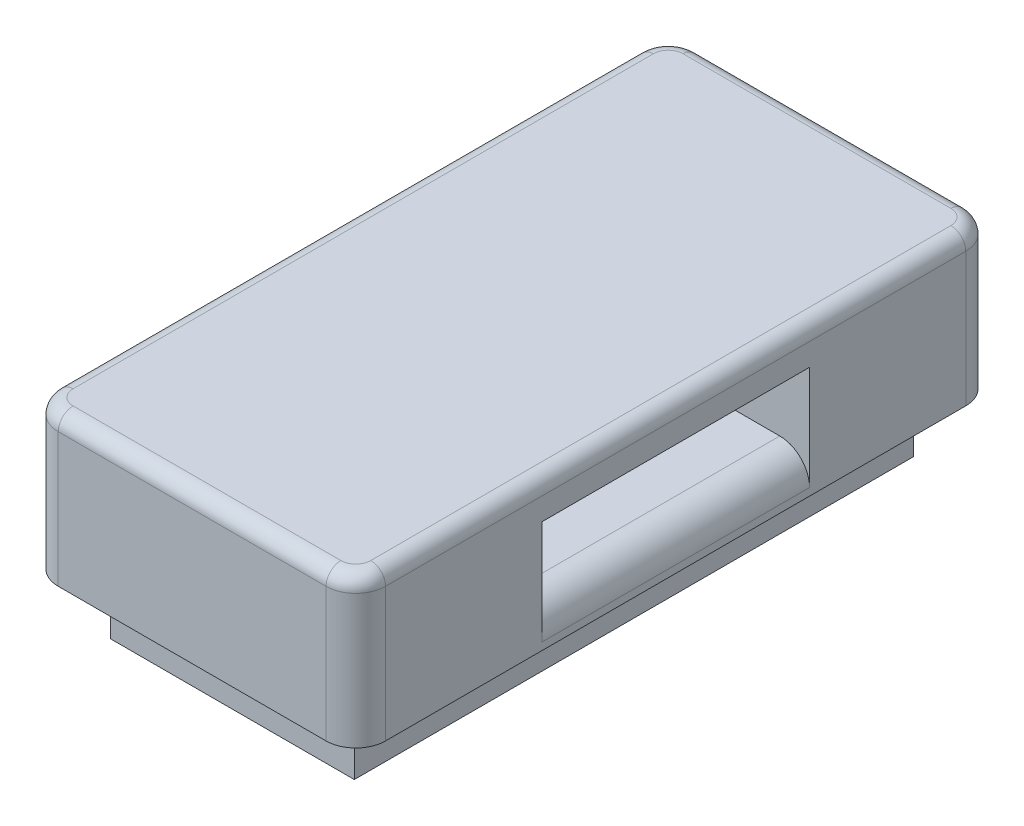
ISO-10303-21;
HEADER;
FILE_DESCRIPTION(('STEP AP214'),'2;1');
FILE_NAME('part.step','',(''),(''),'','','');
FILE_SCHEMA(('AUTOMOTIVE_DESIGN { 1 0 10303 214 1 1 1 1 }'));
ENDSEC;
DATA;
#1=APPLICATION_CONTEXT('core data for automotive mechanical design processes');
#2=APPLICATION_PROTOCOL_DEFINITION('international standard','automotive_design',2000,#1);
#3=PRODUCT_CONTEXT('',#1,'mechanical');
#4=PRODUCT('Part','Part','',(#3));
#5=PRODUCT_RELATED_PRODUCT_CATEGORY('part','',(#4));
#6=PRODUCT_DEFINITION_FORMATION('','',#4);
#7=PRODUCT_DEFINITION_CONTEXT('part definition',#1,'design');
#8=PRODUCT_DEFINITION('design','',#6,#7);
#9=PRODUCT_DEFINITION_SHAPE('','',#8);
#10=(LENGTH_UNIT() NAMED_UNIT(*) SI_UNIT(.MILLI.,.METRE.));
#11=(NAMED_UNIT(*) PLANE_ANGLE_UNIT() SI_UNIT($,.RADIAN.));
#12=(NAMED_UNIT(*) SI_UNIT($,.STERADIAN.) SOLID_ANGLE_UNIT());
#13=UNCERTAINTY_MEASURE_WITH_UNIT(LENGTH_MEASURE(1.E-05),#10,'distance_accuracy_value','');
#14=(GEOMETRIC_REPRESENTATION_CONTEXT(3) GLOBAL_UNCERTAINTY_ASSIGNED_CONTEXT((#13)) GLOBAL_UNIT_ASSIGNED_CONTEXT((#10,
#11,#12)) REPRESENTATION_CONTEXT('',''));
#15=CARTESIAN_POINT('',(0.,0.,0.));
#16=DIRECTION('',(0.,0.,1.));
#17=DIRECTION('',(1.,0.,0.));
#18=AXIS2_PLACEMENT_3D('',#15,#16,#17);
#19=CARTESIAN_POINT('',(-9.,10.,-19.5));
#20=DIRECTION('',(0.,-1.,0.));
#21=DIRECTION('',(0.,0.,-1.));
#22=AXIS2_PLACEMENT_3D('',#19,#20,#21);
#23=CYLINDRICAL_SURFACE('',#22,2.);
#24=DIRECTION('',(0.,-1.,0.));
#25=VECTOR('',#24,1.);
#26=CARTESIAN_POINT('',(-11.,10.,-19.5));
#27=LINE('',#26,#25);
#28=CARTESIAN_POINT('',(-11.,9.,-19.5));
#29=VERTEX_POINT('',#28);
#30=CARTESIAN_POINT('',(-11.,0.,-19.5));
#31=VERTEX_POINT('',#30);
#32=EDGE_CURVE('E320',#29,#31,#27,.T.);
#33=ORIENTED_EDGE('',*,*,#32,.F.);
#34=CARTESIAN_POINT('',(-9.,9.,-19.5));
#35=DIRECTION('',(0.,-1.,0.));
#36=DIRECTION('',(0.,0.,-1.));
#37=AXIS2_PLACEMENT_3D('',#34,#35,#36);
#38=CIRCLE('',#37,2.);
#39=CARTESIAN_POINT('',(-8.99999999999998,9.,-21.5));
#40=VERTEX_POINT('',#39);
#41=EDGE_CURVE('E401',#29,#40,#38,.T.);
#42=ORIENTED_EDGE('',*,*,#41,.T.);
#43=DIRECTION('',(0.,-1.,0.));
#44=VECTOR('',#43,1.);
#45=CARTESIAN_POINT('',(-8.99999999999998,10.,-21.5));
#46=LINE('',#45,#44);
#47=CARTESIAN_POINT('',(-8.99999999999998,0.,-21.5));
#48=VERTEX_POINT('',#47);
#49=EDGE_CURVE('E319',#40,#48,#46,.T.);
#50=ORIENTED_EDGE('',*,*,#49,.T.);
#51=CARTESIAN_POINT('',(-9.,0.,-19.5));
#52=DIRECTION('',(0.,-1.,0.));
#53=DIRECTION('',(0.,0.,-1.));
#54=AXIS2_PLACEMENT_3D('',#51,#52,#53);
#55=CIRCLE('',#54,2.);
#56=EDGE_CURVE('E278',#31,#48,#55,.T.);
#57=ORIENTED_EDGE('',*,*,#56,.F.);
#58=EDGE_LOOP('',(#33,#42,#50,#57));
#59=FACE_BOUND('',#58,.T.);
#60=ADVANCED_FACE('F46',(#59),#23,.T.);
#61=CARTESIAN_POINT('',(-11.,10.,19.5));
#62=DIRECTION('',(-1.,0.,0.));
#63=DIRECTION('',(0.,0.,1.));
#64=AXIS2_PLACEMENT_3D('',#61,#62,#63);
#65=PLANE('',#64);
#66=DIRECTION('',(0.,0.,-1.));
#67=VECTOR('',#66,1.);
#68=CARTESIAN_POINT('',(-11.,0.499999999999999,19.5));
#69=LINE('',#68,#67);
#70=CARTESIAN_POINT('',(-11.,0.499999999999999,9.));
#71=VERTEX_POINT('',#70);
#72=CARTESIAN_POINT('',(-11.,0.499999999999999,-9.));
#73=VERTEX_POINT('',#72);
#74=EDGE_CURVE('E353',#71,#73,#69,.T.);
#75=ORIENTED_EDGE('',*,*,#74,.T.);
#76=DIRECTION('',(0.,-1.,0.));
#77=VECTOR('',#76,1.);
#78=CARTESIAN_POINT('',(-11.,7.5,-9.));
#79=LINE('',#78,#77);
#80=CARTESIAN_POINT('',(-11.,7.5,-9.));
#81=VERTEX_POINT('',#80);
#82=EDGE_CURVE('E226',#81,#73,#79,.T.);
#83=ORIENTED_EDGE('',*,*,#82,.F.);
#84=DIRECTION('',(0.,0.,-1.));
#85=VECTOR('',#84,1.);
#86=CARTESIAN_POINT('',(-11.,7.5,9.));
#87=LINE('',#86,#85);
#88=CARTESIAN_POINT('',(-11.,7.5,9.));
#89=VERTEX_POINT('',#88);
#90=EDGE_CURVE('E204',#89,#81,#87,.T.);
#91=ORIENTED_EDGE('',*,*,#90,.F.);
#92=DIRECTION('',(0.,-1.,0.));
#93=VECTOR('',#92,1.);
#94=CARTESIAN_POINT('',(-11.,7.5,9.));
#95=LINE('',#94,#93);
#96=EDGE_CURVE('E223',#89,#71,#95,.T.);
#97=ORIENTED_EDGE('',*,*,#96,.T.);
#98=EDGE_LOOP('',(#75,#83,#91,#97));
#99=FACE_BOUND('',#98,.T.);
#100=DIRECTION('',(0.,-1.,0.));
#101=VECTOR('',#100,1.);
#102=CARTESIAN_POINT('',(-11.,10.,19.5));
#103=LINE('',#102,#101);
#104=CARTESIAN_POINT('',(-11.,9.,19.5));
#105=VERTEX_POINT('',#104);
#106=CARTESIAN_POINT('',(-11.,0.,19.5));
#107=VERTEX_POINT('',#106);
#108=EDGE_CURVE('E324',#105,#107,#103,.T.);
#109=ORIENTED_EDGE('',*,*,#108,.F.);
#110=DIRECTION('',(0.,0.,-1.));
#111=VECTOR('',#110,1.);
#112=CARTESIAN_POINT('',(-11.,9.,-19.5));
#113=LINE('',#112,#111);
#114=EDGE_CURVE('E398',#105,#29,#113,.T.);
#115=ORIENTED_EDGE('',*,*,#114,.T.);
#116=ORIENTED_EDGE('',*,*,#32,.T.);
#117=DIRECTION('',(0.,0.,-1.));
#118=VECTOR('',#117,1.);
#119=CARTESIAN_POINT('',(-11.,0.,19.5));
#120=LINE('',#119,#118);
#121=EDGE_CURVE('E315',#107,#31,#120,.T.);
#122=ORIENTED_EDGE('',*,*,#121,.F.);
#123=EDGE_LOOP('',(#109,#115,#116,#122));
#124=FACE_BOUND('',#123,.T.);
#125=ADVANCED_FACE('F478',(#99,#124),#65,.T.);
#126=CARTESIAN_POINT('',(-9.,10.,19.5));
#127=DIRECTION('',(0.,-1.,0.));
#128=DIRECTION('',(0.,0.,-1.));
#129=AXIS2_PLACEMENT_3D('',#126,#127,#128);
#130=CYLINDRICAL_SURFACE('',#129,2.);
#131=DIRECTION('',(0.,-1.,0.));
#132=VECTOR('',#131,1.);
#133=CARTESIAN_POINT('',(-8.99999999999998,10.,21.5));
#134=LINE('',#133,#132);
#135=CARTESIAN_POINT('',(-8.99999999999998,9.,21.5));
#136=VERTEX_POINT('',#135);
#137=CARTESIAN_POINT('',(-8.99999999999998,0.,21.5));
#138=VERTEX_POINT('',#137);
#139=EDGE_CURVE('E327',#136,#138,#134,.T.);
#140=ORIENTED_EDGE('',*,*,#139,.F.);
#141=CARTESIAN_POINT('',(-9.,9.,19.5));
#142=DIRECTION('',(0.,-1.,0.));
#143=DIRECTION('',(0.,0.,-1.));
#144=AXIS2_PLACEMENT_3D('',#141,#142,#143);
#145=CIRCLE('',#144,2.);
#146=EDGE_CURVE('E369',#136,#105,#145,.T.);
#147=ORIENTED_EDGE('',*,*,#146,.T.);
#148=ORIENTED_EDGE('',*,*,#108,.T.);
#149=CARTESIAN_POINT('',(-9.,0.,19.5));
#150=DIRECTION('',(0.,-1.,0.));
#151=DIRECTION('',(0.,0.,-1.));
#152=AXIS2_PLACEMENT_3D('',#149,#150,#151);
#153=CIRCLE('',#152,2.);
#154=EDGE_CURVE('E311',#138,#107,#153,.T.);
#155=ORIENTED_EDGE('',*,*,#154,.F.);
#156=EDGE_LOOP('',(#140,#147,#148,#155));
#157=FACE_BOUND('',#156,.T.);
#158=ADVANCED_FACE('F471',(#157),#130,.T.);
#159=CARTESIAN_POINT('',(-8.99999999999998,10.,21.5));
#160=DIRECTION('',(0.,0.,-1.));
#161=DIRECTION('',(-1.,0.,0.));
#162=AXIS2_PLACEMENT_3D('',#159,#160,#161);
#163=PLANE('',#162);
#164=DIRECTION('',(0.,-1.,0.));
#165=VECTOR('',#164,1.);
#166=CARTESIAN_POINT('',(8.99999999999999,10.,21.5));
#167=LINE('',#166,#165);
#168=CARTESIAN_POINT('',(8.99999999999999,9.,21.5));
#169=VERTEX_POINT('',#168);
#170=CARTESIAN_POINT('',(8.99999999999999,0.,21.5));
#171=VERTEX_POINT('',#170);
#172=EDGE_CURVE('E330',#169,#171,#167,.T.);
#173=ORIENTED_EDGE('',*,*,#172,.F.);
#174=DIRECTION('',(1.,0.,0.));
#175=VECTOR('',#174,1.);
#176=CARTESIAN_POINT('',(-8.99999999999998,9.,21.5));
#177=LINE('',#176,#175);
#178=EDGE_CURVE('E11',#169,#136,#177,.F.);
#179=ORIENTED_EDGE('',*,*,#178,.T.);
#180=ORIENTED_EDGE('',*,*,#139,.T.);
#181=DIRECTION('',(1.,0.,0.));
#182=VECTOR('',#181,1.);
#183=CARTESIAN_POINT('',(-8.99999999999998,0.,21.5));
#184=LINE('',#183,#182);
#185=EDGE_CURVE('E307',#138,#171,#184,.T.);
#186=ORIENTED_EDGE('',*,*,#185,.T.);
#187=EDGE_LOOP('',(#173,#179,#180,#186));
#188=FACE_BOUND('',#187,.T.);
#189=ADVANCED_FACE('F467',(#188),#163,.F.);
#190=CARTESIAN_POINT('',(9.,10.,19.5));
#191=DIRECTION('',(0.,-1.,0.));
#192=DIRECTION('',(0.,0.,-1.));
#193=AXIS2_PLACEMENT_3D('',#190,#191,#192);
#194=CYLINDRICAL_SURFACE('',#193,2.);
#195=DIRECTION('',(0.,-1.,0.));
#196=VECTOR('',#195,1.);
#197=CARTESIAN_POINT('',(11.,10.,19.5));
#198=LINE('',#197,#196);
#199=CARTESIAN_POINT('',(11.,9.,19.5));
#200=VERTEX_POINT('',#199);
#201=CARTESIAN_POINT('',(11.,0.,19.5));
#202=VERTEX_POINT('',#201);
#203=EDGE_CURVE('E333',#200,#202,#198,.T.);
#204=ORIENTED_EDGE('',*,*,#203,.F.);
#205=CARTESIAN_POINT('',(9.,9.,19.5));
#206=DIRECTION('',(0.,-1.,0.));
#207=DIRECTION('',(0.,0.,-1.));
#208=AXIS2_PLACEMENT_3D('',#205,#206,#207);
#209=CIRCLE('',#208,2.);
#210=EDGE_CURVE('E56',#200,#169,#209,.T.);
#211=ORIENTED_EDGE('',*,*,#210,.T.);
#212=ORIENTED_EDGE('',*,*,#172,.T.);
#213=CARTESIAN_POINT('',(9.,0.,19.5));
#214=DIRECTION('',(0.,1.,0.));
#215=DIRECTION('',(0.,0.,1.));
#216=AXIS2_PLACEMENT_3D('',#213,#214,#215);
#217=CIRCLE('',#216,2.);
#218=EDGE_CURVE('E303',#171,#202,#217,.T.);
#219=ORIENTED_EDGE('',*,*,#218,.T.);
#220=EDGE_LOOP('',(#204,#211,#212,#219));
#221=FACE_BOUND('',#220,.T.);
#222=ADVANCED_FACE('F493',(#221),#194,.T.);
#223=CARTESIAN_POINT('',(11.,10.,19.5));
#224=DIRECTION('',(-1.,0.,0.));
#225=DIRECTION('',(0.,0.,1.));
#226=AXIS2_PLACEMENT_3D('',#223,#224,#225);
#227=PLANE('',#226);
#228=DIRECTION('',(0.,-1.,0.));
#229=VECTOR('',#228,1.);
#230=CARTESIAN_POINT('',(11.,7.5,-9.));
#231=LINE('',#230,#229);
#232=CARTESIAN_POINT('',(11.,7.5,-9.));
#233=VERTEX_POINT('',#232);
#234=CARTESIAN_POINT('',(11.,0.5,-9.));
#235=VERTEX_POINT('',#234);
#236=EDGE_CURVE('E212',#233,#235,#231,.T.);
#237=ORIENTED_EDGE('',*,*,#236,.T.);
#238=DIRECTION('',(0.,0.,-1.));
#239=VECTOR('',#238,1.);
#240=CARTESIAN_POINT('',(11.,0.5,9.));
#241=LINE('',#240,#239);
#242=CARTESIAN_POINT('',(11.,0.5,9.));
#243=VERTEX_POINT('',#242);
#244=EDGE_CURVE('E350',#235,#243,#241,.F.);
#245=ORIENTED_EDGE('',*,*,#244,.T.);
#246=DIRECTION('',(0.,-1.,0.));
#247=VECTOR('',#246,1.);
#248=CARTESIAN_POINT('',(11.,7.5,9.));
#249=LINE('',#248,#247);
#250=CARTESIAN_POINT('',(11.,7.5,9.));
#251=VERTEX_POINT('',#250);
#252=EDGE_CURVE('E209',#251,#243,#249,.T.);
#253=ORIENTED_EDGE('',*,*,#252,.F.);
#254=DIRECTION('',(0.,0.,-1.));
#255=VECTOR('',#254,1.);
#256=CARTESIAN_POINT('',(11.,7.5,9.));
#257=LINE('',#256,#255);
#258=EDGE_CURVE('E201',#251,#233,#257,.T.);
#259=ORIENTED_EDGE('',*,*,#258,.T.);
#260=EDGE_LOOP('',(#237,#245,#253,#259));
#261=FACE_BOUND('',#260,.T.);
#262=DIRECTION('',(0.,-1.,0.));
#263=VECTOR('',#262,1.);
#264=CARTESIAN_POINT('',(11.,10.,-19.5));
#265=LINE('',#264,#263);
#266=CARTESIAN_POINT('',(11.,9.,-19.5));
#267=VERTEX_POINT('',#266);
#268=CARTESIAN_POINT('',(11.,0.,-19.5));
#269=VERTEX_POINT('',#268);
#270=EDGE_CURVE('E336',#267,#269,#265,.T.);
#271=ORIENTED_EDGE('',*,*,#270,.F.);
#272=DIRECTION('',(0.,0.,-1.));
#273=VECTOR('',#272,1.);
#274=CARTESIAN_POINT('',(11.,9.,19.5));
#275=LINE('',#274,#273);
#276=EDGE_CURVE('E71',#267,#200,#275,.F.);
#277=ORIENTED_EDGE('',*,*,#276,.T.);
#278=ORIENTED_EDGE('',*,*,#203,.T.);
#279=DIRECTION('',(0.,0.,-1.));
#280=VECTOR('',#279,1.);
#281=CARTESIAN_POINT('',(11.,0.,19.5));
#282=LINE('',#281,#280);
#283=EDGE_CURVE('E299',#202,#269,#282,.T.);
#284=ORIENTED_EDGE('',*,*,#283,.T.);
#285=EDGE_LOOP('',(#271,#277,#278,#284));
#286=FACE_BOUND('',#285,.T.);
#287=ADVANCED_FACE('F221',(#261,#286),#227,.F.);
#288=CARTESIAN_POINT('',(9.,10.,-19.5));
#289=DIRECTION('',(0.,-1.,0.));
#290=DIRECTION('',(0.,0.,-1.));
#291=AXIS2_PLACEMENT_3D('',#288,#289,#290);
#292=CYLINDRICAL_SURFACE('',#291,2.);
#293=DIRECTION('',(0.,-1.,0.));
#294=VECTOR('',#293,1.);
#295=CARTESIAN_POINT('',(8.99999999999999,10.,-21.5));
#296=LINE('',#295,#294);
#297=CARTESIAN_POINT('',(8.99999999999999,9.,-21.5));
#298=VERTEX_POINT('',#297);
#299=CARTESIAN_POINT('',(8.99999999999999,0.,-21.5));
#300=VERTEX_POINT('',#299);
#301=EDGE_CURVE('E339',#298,#300,#296,.T.);
#302=ORIENTED_EDGE('',*,*,#301,.F.);
#303=CARTESIAN_POINT('',(9.,9.,-19.5));
#304=DIRECTION('',(0.,-1.,0.));
#305=DIRECTION('',(0.,0.,-1.));
#306=AXIS2_PLACEMENT_3D('',#303,#304,#305);
#307=CIRCLE('',#306,2.);
#308=EDGE_CURVE('E407',#298,#267,#307,.T.);
#309=ORIENTED_EDGE('',*,*,#308,.T.);
#310=ORIENTED_EDGE('',*,*,#270,.T.);
#311=CARTESIAN_POINT('',(9.,0.,-19.5));
#312=DIRECTION('',(0.,-1.,0.));
#313=DIRECTION('',(0.,0.,-1.));
#314=AXIS2_PLACEMENT_3D('',#311,#312,#313);
#315=CIRCLE('',#314,2.);
#316=EDGE_CURVE('E295',#300,#269,#315,.T.);
#317=ORIENTED_EDGE('',*,*,#316,.F.);
#318=EDGE_LOOP('',(#302,#309,#310,#317));
#319=FACE_BOUND('',#318,.T.);
#320=ADVANCED_FACE('F492',(#319),#292,.T.);
#321=CARTESIAN_POINT('',(-8.99999999999998,10.,-21.5));
#322=DIRECTION('',(0.,0.,-1.));
#323=DIRECTION('',(-1.,0.,0.));
#324=AXIS2_PLACEMENT_3D('',#321,#322,#323);
#325=PLANE('',#324);
#326=ORIENTED_EDGE('',*,*,#49,.F.);
#327=DIRECTION('',(1.,0.,0.));
#328=VECTOR('',#327,1.);
#329=CARTESIAN_POINT('',(8.99999999999999,9.,-21.5));
#330=LINE('',#329,#328);
#331=EDGE_CURVE('E404',#40,#298,#330,.T.);
#332=ORIENTED_EDGE('',*,*,#331,.T.);
#333=ORIENTED_EDGE('',*,*,#301,.T.);
#334=DIRECTION('',(1.,0.,0.));
#335=VECTOR('',#334,1.);
#336=CARTESIAN_POINT('',(-8.99999999999998,0.,-21.5));
#337=LINE('',#336,#335);
#338=EDGE_CURVE('E291',#48,#300,#337,.T.);
#339=ORIENTED_EDGE('',*,*,#338,.F.);
#340=EDGE_LOOP('',(#326,#332,#333,#339));
#341=FACE_BOUND('',#340,.T.);
#342=ADVANCED_FACE('F489',(#341),#325,.T.);
#343=CARTESIAN_POINT('',(-9.,10.,-19.5));
#344=DIRECTION('',(0.,-1.,0.));
#345=DIRECTION('',(0.,0.,-1.));
#346=AXIS2_PLACEMENT_3D('',#343,#344,#345);
#347=PLANE('',#346);
#348=DIRECTION('',(0.,0.,-1.));
#349=VECTOR('',#348,1.);
#350=CARTESIAN_POINT('',(-10.,10.,19.5));
#351=LINE('',#350,#349);
#352=CARTESIAN_POINT('',(-10.,10.,-19.5));
#353=VERTEX_POINT('',#352);
#354=CARTESIAN_POINT('',(-10.,10.,19.5));
#355=VERTEX_POINT('',#354);
#356=EDGE_CURVE('E391',#353,#355,#351,.F.);
#357=ORIENTED_EDGE('',*,*,#356,.T.);
#358=CARTESIAN_POINT('',(-9.,10.,19.5));
#359=DIRECTION('',(0.,-1.,0.));
#360=DIRECTION('',(0.,0.,-1.));
#361=AXIS2_PLACEMENT_3D('',#358,#359,#360);
#362=CIRCLE('',#361,0.999999999999999);
#363=CARTESIAN_POINT('',(-8.99999999999999,10.,20.5));
#364=VERTEX_POINT('',#363);
#365=EDGE_CURVE('E394',#355,#364,#362,.F.);
#366=ORIENTED_EDGE('',*,*,#365,.T.);
#367=DIRECTION('',(1.,0.,0.));
#368=VECTOR('',#367,1.);
#369=CARTESIAN_POINT('',(-9.,10.,20.5));
#370=LINE('',#369,#368);
#371=CARTESIAN_POINT('',(8.99999999999999,10.,20.5));
#372=VERTEX_POINT('',#371);
#373=EDGE_CURVE('E373',#364,#372,#370,.T.);
#374=ORIENTED_EDGE('',*,*,#373,.T.);
#375=CARTESIAN_POINT('',(9.,10.,19.5));
#376=DIRECTION('',(0.,-1.,0.));
#377=DIRECTION('',(0.,0.,-1.));
#378=AXIS2_PLACEMENT_3D('',#375,#376,#377);
#379=CIRCLE('',#378,0.999999999999999);
#380=CARTESIAN_POINT('',(10.,10.,19.5));
#381=VERTEX_POINT('',#380);
#382=EDGE_CURVE('E376',#372,#381,#379,.F.);
#383=ORIENTED_EDGE('',*,*,#382,.T.);
#384=DIRECTION('',(0.,0.,-1.));
#385=VECTOR('',#384,1.);
#386=CARTESIAN_POINT('',(10.,10.,-19.5));
#387=LINE('',#386,#385);
#388=CARTESIAN_POINT('',(10.,10.,-19.5));
#389=VERTEX_POINT('',#388);
#390=EDGE_CURVE('E379',#381,#389,#387,.T.);
#391=ORIENTED_EDGE('',*,*,#390,.T.);
#392=CARTESIAN_POINT('',(9.,10.,-19.5));
#393=DIRECTION('',(0.,-1.,0.));
#394=DIRECTION('',(0.,0.,-1.));
#395=AXIS2_PLACEMENT_3D('',#392,#393,#394);
#396=CIRCLE('',#395,0.999999999999999);
#397=CARTESIAN_POINT('',(8.99999999999999,10.,-20.5));
#398=VERTEX_POINT('',#397);
#399=EDGE_CURVE('E382',#389,#398,#396,.F.);
#400=ORIENTED_EDGE('',*,*,#399,.T.);
#401=DIRECTION('',(1.,0.,0.));
#402=VECTOR('',#401,1.);
#403=CARTESIAN_POINT('',(-8.99999999999998,10.,-20.5));
#404=LINE('',#403,#402);
#405=CARTESIAN_POINT('',(-8.99999999999999,10.,-20.5));
#406=VERTEX_POINT('',#405);
#407=EDGE_CURVE('E385',#398,#406,#404,.F.);
#408=ORIENTED_EDGE('',*,*,#407,.T.);
#409=CARTESIAN_POINT('',(-9.,10.,-19.5));
#410=DIRECTION('',(0.,-1.,0.));
#411=DIRECTION('',(0.,0.,-1.));
#412=AXIS2_PLACEMENT_3D('',#409,#410,#411);
#413=CIRCLE('',#412,0.999999999999999);
#414=EDGE_CURVE('E388',#406,#353,#413,.F.);
#415=ORIENTED_EDGE('',*,*,#414,.T.);
#416=EDGE_LOOP('',(#357,#366,#374,#383,#391,#400,#408,#415));
#417=FACE_BOUND('',#416,.T.);
#418=ADVANCED_FACE('F453',(#417),#347,.F.);
#419=CARTESIAN_POINT('',(-9.,0.,-19.5));
#420=DIRECTION('',(0.,-1.,0.));
#421=DIRECTION('',(0.,0.,-1.));
#422=AXIS2_PLACEMENT_3D('',#419,#420,#421);
#423=PLANE('',#422);
#424=DIRECTION('',(0.,0.,-1.));
#425=VECTOR('',#424,1.);
#426=CARTESIAN_POINT('',(-8.2,0.,0.));
#427=LINE('',#426,#425);
#428=CARTESIAN_POINT('',(-8.2,0.,18.8));
#429=VERTEX_POINT('',#428);
#430=CARTESIAN_POINT('',(-8.2,0.,-18.8));
#431=VERTEX_POINT('',#430);
#432=EDGE_CURVE('E238',#429,#431,#427,.T.);
#433=ORIENTED_EDGE('',*,*,#432,.F.);
#434=DIRECTION('',(-1.,0.,0.));
#435=VECTOR('',#434,1.);
#436=CARTESIAN_POINT('',(0.,0.,18.8));
#437=LINE('',#436,#435);
#438=CARTESIAN_POINT('',(8.2,0.,18.8));
#439=VERTEX_POINT('',#438);
#440=EDGE_CURVE('E264',#439,#429,#437,.T.);
#441=ORIENTED_EDGE('',*,*,#440,.F.);
#442=DIRECTION('',(0.,0.,-1.));
#443=VECTOR('',#442,1.);
#444=CARTESIAN_POINT('',(8.2,0.,0.));
#445=LINE('',#444,#443);
#446=CARTESIAN_POINT('',(8.2,0.,-18.8));
#447=VERTEX_POINT('',#446);
#448=EDGE_CURVE('E267',#439,#447,#445,.T.);
#449=ORIENTED_EDGE('',*,*,#448,.T.);
#450=DIRECTION('',(-1.,0.,0.));
#451=VECTOR('',#450,1.);
#452=CARTESIAN_POINT('',(0.,0.,-18.8));
#453=LINE('',#452,#451);
#454=EDGE_CURVE('E250',#447,#431,#453,.T.);
#455=ORIENTED_EDGE('',*,*,#454,.T.);
#456=EDGE_LOOP('',(#433,#441,#449,#455));
#457=FACE_BOUND('',#456,.T.);
#458=ORIENTED_EDGE('',*,*,#56,.T.);
#459=ORIENTED_EDGE('',*,*,#338,.T.);
#460=ORIENTED_EDGE('',*,*,#316,.T.);
#461=ORIENTED_EDGE('',*,*,#283,.F.);
#462=ORIENTED_EDGE('',*,*,#218,.F.);
#463=ORIENTED_EDGE('',*,*,#185,.F.);
#464=ORIENTED_EDGE('',*,*,#154,.T.);
#465=ORIENTED_EDGE('',*,*,#121,.T.);
#466=EDGE_LOOP('',(#458,#459,#460,#461,#462,#463,#464,#465));
#467=FACE_BOUND('',#466,.T.);
#468=ADVANCED_FACE('F475',(#457,#467),#423,.T.);
#469=CARTESIAN_POINT('',(-8.2,-4.,0.));
#470=DIRECTION('',(1.,0.,0.));
#471=DIRECTION('',(0.,0.,-1.));
#472=AXIS2_PLACEMENT_3D('',#469,#470,#471);
#473=PLANE('',#472);
#474=ORIENTED_EDGE('',*,*,#432,.T.);
#475=DIRECTION('',(0.,1.,0.));
#476=VECTOR('',#475,1.);
#477=CARTESIAN_POINT('',(-8.2,-4.,-18.8));
#478=LINE('',#477,#476);
#479=CARTESIAN_POINT('',(-8.2,-4.,-18.8));
#480=VERTEX_POINT('',#479);
#481=EDGE_CURVE('E274',#480,#431,#478,.T.);
#482=ORIENTED_EDGE('',*,*,#481,.F.);
#483=DIRECTION('',(0.,0.,-1.));
#484=VECTOR('',#483,1.);
#485=CARTESIAN_POINT('',(-8.2,-4.,0.));
#486=LINE('',#485,#484);
#487=CARTESIAN_POINT('',(-8.2,-4.,18.8));
#488=VERTEX_POINT('',#487);
#489=EDGE_CURVE('E246',#488,#480,#486,.T.);
#490=ORIENTED_EDGE('',*,*,#489,.F.);
#491=DIRECTION('',(0.,1.,0.));
#492=VECTOR('',#491,1.);
#493=CARTESIAN_POINT('',(-8.2,-4.,18.8));
#494=LINE('',#493,#492);
#495=EDGE_CURVE('E261',#488,#429,#494,.T.);
#496=ORIENTED_EDGE('',*,*,#495,.T.);
#497=EDGE_LOOP('',(#474,#482,#490,#496));
#498=FACE_BOUND('',#497,.T.);
#499=ADVANCED_FACE('F604',(#498),#473,.F.);
#500=CARTESIAN_POINT('',(0.,-4.,-18.8));
#501=DIRECTION('',(0.,0.,-1.));
#502=DIRECTION('',(-1.,0.,0.));
#503=AXIS2_PLACEMENT_3D('',#500,#501,#502);
#504=PLANE('',#503);
#505=ORIENTED_EDGE('',*,*,#454,.F.);
#506=DIRECTION('',(0.,1.,0.));
#507=VECTOR('',#506,1.);
#508=CARTESIAN_POINT('',(8.2,-4.,-18.8));
#509=LINE('',#508,#507);
#510=CARTESIAN_POINT('',(8.2,-4.,-18.8));
#511=VERTEX_POINT('',#510);
#512=EDGE_CURVE('E279',#511,#447,#509,.T.);
#513=ORIENTED_EDGE('',*,*,#512,.F.);
#514=DIRECTION('',(-1.,0.,0.));
#515=VECTOR('',#514,1.);
#516=CARTESIAN_POINT('',(0.,-4.,-18.8));
#517=LINE('',#516,#515);
#518=EDGE_CURVE('E257',#511,#480,#517,.T.);
#519=ORIENTED_EDGE('',*,*,#518,.T.);
#520=ORIENTED_EDGE('',*,*,#481,.T.);
#521=EDGE_LOOP('',(#505,#513,#519,#520));
#522=FACE_BOUND('',#521,.T.);
#523=ADVANCED_FACE('F609',(#522),#504,.T.);
#524=CARTESIAN_POINT('',(8.2,-4.,0.));
#525=DIRECTION('',(1.,0.,0.));
#526=DIRECTION('',(0.,0.,-1.));
#527=AXIS2_PLACEMENT_3D('',#524,#525,#526);
#528=PLANE('',#527);
#529=ORIENTED_EDGE('',*,*,#448,.F.);
#530=DIRECTION('',(0.,1.,0.));
#531=VECTOR('',#530,1.);
#532=CARTESIAN_POINT('',(8.2,-4.,18.8));
#533=LINE('',#532,#531);
#534=CARTESIAN_POINT('',(8.2,-4.,18.8));
#535=VERTEX_POINT('',#534);
#536=EDGE_CURVE('E282',#535,#439,#533,.T.);
#537=ORIENTED_EDGE('',*,*,#536,.F.);
#538=DIRECTION('',(0.,0.,-1.));
#539=VECTOR('',#538,1.);
#540=CARTESIAN_POINT('',(8.2,-4.,0.));
#541=LINE('',#540,#539);
#542=EDGE_CURVE('E253',#535,#511,#541,.T.);
#543=ORIENTED_EDGE('',*,*,#542,.T.);
#544=ORIENTED_EDGE('',*,*,#512,.T.);
#545=EDGE_LOOP('',(#529,#537,#543,#544));
#546=FACE_BOUND('',#545,.T.);
#547=ADVANCED_FACE('F615',(#546),#528,.T.);
#548=CARTESIAN_POINT('',(0.,-4.,18.8));
#549=DIRECTION('',(0.,0.,-1.));
#550=DIRECTION('',(-1.,0.,0.));
#551=AXIS2_PLACEMENT_3D('',#548,#549,#550);
#552=PLANE('',#551);
#553=ORIENTED_EDGE('',*,*,#440,.T.);
#554=ORIENTED_EDGE('',*,*,#495,.F.);
#555=DIRECTION('',(-1.,0.,0.));
#556=VECTOR('',#555,1.);
#557=CARTESIAN_POINT('',(0.,-4.,18.8));
#558=LINE('',#557,#556);
#559=EDGE_CURVE('E249',#535,#488,#558,.T.);
#560=ORIENTED_EDGE('',*,*,#559,.F.);
#561=ORIENTED_EDGE('',*,*,#536,.T.);
#562=EDGE_LOOP('',(#553,#554,#560,#561));
#563=FACE_BOUND('',#562,.T.);
#564=ADVANCED_FACE('F611',(#563),#552,.F.);
#565=CARTESIAN_POINT('',(0.,-4.,0.));
#566=DIRECTION('',(0.,1.,0.));
#567=DIRECTION('',(0.,0.,1.));
#568=AXIS2_PLACEMENT_3D('',#565,#566,#567);
#569=PLANE('',#568);
#570=ORIENTED_EDGE('',*,*,#489,.T.);
#571=ORIENTED_EDGE('',*,*,#518,.F.);
#572=ORIENTED_EDGE('',*,*,#542,.F.);
#573=ORIENTED_EDGE('',*,*,#559,.T.);
#574=EDGE_LOOP('',(#570,#571,#572,#573));
#575=FACE_BOUND('',#574,.T.);
#576=ADVANCED_FACE('F614',(#575),#569,.F.);
#577=CARTESIAN_POINT('',(11.,7.5,9.));
#578=DIRECTION('',(0.,1.,0.));
#579=DIRECTION('',(0.,0.,1.));
#580=AXIS2_PLACEMENT_3D('',#577,#578,#579);
#581=PLANE('',#580);
#582=ORIENTED_EDGE('',*,*,#90,.T.);
#583=DIRECTION('',(-1.,0.,0.));
#584=VECTOR('',#583,1.);
#585=CARTESIAN_POINT('',(11.,7.5,-9.));
#586=LINE('',#585,#584);
#587=EDGE_CURVE('E197',#233,#81,#586,.T.);
#588=ORIENTED_EDGE('',*,*,#587,.F.);
#589=ORIENTED_EDGE('',*,*,#258,.F.);
#590=DIRECTION('',(-1.,0.,0.));
#591=VECTOR('',#590,1.);
#592=CARTESIAN_POINT('',(11.,7.5,9.));
#593=LINE('',#592,#591);
#594=EDGE_CURVE('E235',#251,#89,#593,.T.);
#595=ORIENTED_EDGE('',*,*,#594,.T.);
#596=EDGE_LOOP('',(#582,#588,#589,#595));
#597=FACE_BOUND('',#596,.T.);
#598=ADVANCED_FACE('F199',(#597),#581,.F.);
#599=CARTESIAN_POINT('',(11.,7.5,9.));
#600=DIRECTION('',(0.,0.,-1.));
#601=DIRECTION('',(0.,1.,0.));
#602=AXIS2_PLACEMENT_3D('',#599,#600,#601);
#603=PLANE('',#602);
#604=ORIENTED_EDGE('',*,*,#96,.F.);
#605=ORIENTED_EDGE('',*,*,#594,.F.);
#606=ORIENTED_EDGE('',*,*,#252,.T.);
#607=CARTESIAN_POINT('',(9.,0.5,9.));
#608=DIRECTION('',(0.,0.,-1.));
#609=DIRECTION('',(0.,1.,0.));
#610=AXIS2_PLACEMENT_3D('',#607,#608,#609);
#611=CIRCLE('',#610,2.);
#612=CARTESIAN_POINT('',(9.,2.5,9.));
#613=VERTEX_POINT('',#612);
#614=EDGE_CURVE('E359',#243,#613,#611,.F.);
#615=ORIENTED_EDGE('',*,*,#614,.T.);
#616=DIRECTION('',(-1.,0.,0.));
#617=VECTOR('',#616,1.);
#618=CARTESIAN_POINT('',(11.,2.5,9.));
#619=LINE('',#618,#617);
#620=CARTESIAN_POINT('',(-9.,2.5,9.));
#621=VERTEX_POINT('',#620);
#622=EDGE_CURVE('E239',#613,#621,#619,.T.);
#623=ORIENTED_EDGE('',*,*,#622,.T.);
#624=CARTESIAN_POINT('',(-9.,0.499999999999999,9.));
#625=DIRECTION('',(0.,0.,-1.));
#626=DIRECTION('',(0.,1.,0.));
#627=AXIS2_PLACEMENT_3D('',#624,#625,#626);
#628=CIRCLE('',#627,2.);
#629=EDGE_CURVE('E365',#621,#71,#628,.F.);
#630=ORIENTED_EDGE('',*,*,#629,.T.);
#631=EDGE_LOOP('',(#604,#605,#606,#615,#623,#630));
#632=FACE_BOUND('',#631,.T.);
#633=ADVANCED_FACE('F628',(#632),#603,.T.);
#634=CARTESIAN_POINT('',(11.,2.5,9.));
#635=DIRECTION('',(0.,1.,0.));
#636=DIRECTION('',(0.,0.,1.));
#637=AXIS2_PLACEMENT_3D('',#634,#635,#636);
#638=PLANE('',#637);
#639=ORIENTED_EDGE('',*,*,#622,.F.);
#640=DIRECTION('',(0.,0.,-1.));
#641=VECTOR('',#640,1.);
#642=CARTESIAN_POINT('',(9.,2.5,-9.));
#643=LINE('',#642,#641);
#644=CARTESIAN_POINT('',(9.,2.5,-9.));
#645=VERTEX_POINT('',#644);
#646=EDGE_CURVE('E346',#613,#645,#643,.T.);
#647=ORIENTED_EDGE('',*,*,#646,.T.);
#648=DIRECTION('',(-1.,0.,0.));
#649=VECTOR('',#648,1.);
#650=CARTESIAN_POINT('',(11.,2.5,-9.));
#651=LINE('',#650,#649);
#652=CARTESIAN_POINT('',(-9.,2.5,-9.));
#653=VERTEX_POINT('',#652);
#654=EDGE_CURVE('E208',#645,#653,#651,.T.);
#655=ORIENTED_EDGE('',*,*,#654,.T.);
#656=DIRECTION('',(0.,0.,-1.));
#657=VECTOR('',#656,1.);
#658=CARTESIAN_POINT('',(-9.,2.5,9.));
#659=LINE('',#658,#657);
#660=EDGE_CURVE('E323',#653,#621,#659,.F.);
#661=ORIENTED_EDGE('',*,*,#660,.T.);
#662=EDGE_LOOP('',(#639,#647,#655,#661));
#663=FACE_BOUND('',#662,.T.);
#664=ADVANCED_FACE('F631',(#663),#638,.T.);
#665=CARTESIAN_POINT('',(11.,7.5,-9.));
#666=DIRECTION('',(0.,0.,-1.));
#667=DIRECTION('',(-1.,0.,0.));
#668=AXIS2_PLACEMENT_3D('',#665,#666,#667);
#669=PLANE('',#668);
#670=ORIENTED_EDGE('',*,*,#82,.T.);
#671=CARTESIAN_POINT('',(-9.,0.499999999999999,-9.));
#672=DIRECTION('',(0.,0.,-1.));
#673=DIRECTION('',(-1.,0.,0.));
#674=AXIS2_PLACEMENT_3D('',#671,#672,#673);
#675=CIRCLE('',#674,2.);
#676=EDGE_CURVE('E362',#73,#653,#675,.T.);
#677=ORIENTED_EDGE('',*,*,#676,.T.);
#678=ORIENTED_EDGE('',*,*,#654,.F.);
#679=CARTESIAN_POINT('',(9.,0.5,-9.));
#680=DIRECTION('',(0.,0.,-1.));
#681=DIRECTION('',(-1.,0.,0.));
#682=AXIS2_PLACEMENT_3D('',#679,#680,#681);
#683=CIRCLE('',#682,2.);
#684=EDGE_CURVE('E215',#645,#235,#683,.T.);
#685=ORIENTED_EDGE('',*,*,#684,.T.);
#686=ORIENTED_EDGE('',*,*,#236,.F.);
#687=ORIENTED_EDGE('',*,*,#587,.T.);
#688=EDGE_LOOP('',(#670,#677,#678,#685,#686,#687));
#689=FACE_BOUND('',#688,.T.);
#690=ADVANCED_FACE('F213',(#689),#669,.F.);
#691=CARTESIAN_POINT('',(9.,0.5,9.));
#692=DIRECTION('',(0.,0.,1.));
#693=DIRECTION('',(1.,0.,0.));
#694=AXIS2_PLACEMENT_3D('',#691,#692,#693);
#695=CYLINDRICAL_SURFACE('',#694,2.);
#696=ORIENTED_EDGE('',*,*,#614,.F.);
#697=ORIENTED_EDGE('',*,*,#244,.F.);
#698=ORIENTED_EDGE('',*,*,#684,.F.);
#699=ORIENTED_EDGE('',*,*,#646,.F.);
#700=EDGE_LOOP('',(#696,#697,#698,#699));
#701=FACE_BOUND('',#700,.T.);
#702=ADVANCED_FACE('F513',(#701),#695,.T.);
#703=CARTESIAN_POINT('',(-9.,0.499999999999999,19.5));
#704=DIRECTION('',(0.,0.,-1.));
#705=DIRECTION('',(-1.,0.,0.));
#706=AXIS2_PLACEMENT_3D('',#703,#704,#705);
#707=CYLINDRICAL_SURFACE('',#706,2.);
#708=ORIENTED_EDGE('',*,*,#629,.F.);
#709=ORIENTED_EDGE('',*,*,#660,.F.);
#710=ORIENTED_EDGE('',*,*,#676,.F.);
#711=ORIENTED_EDGE('',*,*,#74,.F.);
#712=EDGE_LOOP('',(#708,#709,#710,#711));
#713=FACE_BOUND('',#712,.T.);
#714=ADVANCED_FACE('F516',(#713),#707,.T.);
#715=CARTESIAN_POINT('',(9.,9.,-19.5));
#716=DIRECTION('',(0.,-1.,0.));
#717=DIRECTION('',(0.,0.,-1.));
#718=AXIS2_PLACEMENT_3D('',#715,#716,#717);
#719=DEGENERATE_TOROIDAL_SURFACE('',#718,0.999999999999999,1.,.T.);
#720=CARTESIAN_POINT('',(8.99999999999999,9.,-20.5));
#721=DIRECTION('',(-1.,0.,0.));
#722=DIRECTION('',(0.,0.,1.));
#723=AXIS2_PLACEMENT_3D('',#720,#721,#722);
#724=CIRCLE('',#723,1.);
#725=EDGE_CURVE('E435',#398,#298,#724,.T.);
#726=ORIENTED_EDGE('',*,*,#725,.F.);
#727=ORIENTED_EDGE('',*,*,#399,.F.);
#728=CARTESIAN_POINT('',(10.,9.,-19.5));
#729=DIRECTION('',(0.,0.,1.));
#730=DIRECTION('',(1.,0.,0.));
#731=AXIS2_PLACEMENT_3D('',#728,#729,#730);
#732=CIRCLE('',#731,1.);
#733=EDGE_CURVE('E50',#267,#389,#732,.T.);
#734=ORIENTED_EDGE('',*,*,#733,.F.);
#735=ORIENTED_EDGE('',*,*,#308,.F.);
#736=EDGE_LOOP('',(#726,#727,#734,#735));
#737=FACE_BOUND('',#736,.T.);
#738=ADVANCED_FACE('F48',(#737),#719,.T.);
#739=CARTESIAN_POINT('',(10.,9.,-19.5));
#740=DIRECTION('',(0.,0.,-1.));
#741=DIRECTION('',(-1.,0.,0.));
#742=AXIS2_PLACEMENT_3D('',#739,#740,#741);
#743=CYLINDRICAL_SURFACE('',#742,1.);
#744=ORIENTED_EDGE('',*,*,#733,.T.);
#745=ORIENTED_EDGE('',*,*,#390,.F.);
#746=CARTESIAN_POINT('',(10.,9.,19.5));
#747=DIRECTION('',(0.,0.,1.));
#748=DIRECTION('',(1.,0.,0.));
#749=AXIS2_PLACEMENT_3D('',#746,#747,#748);
#750=CIRCLE('',#749,1.);
#751=EDGE_CURVE('E432',#200,#381,#750,.T.);
#752=ORIENTED_EDGE('',*,*,#751,.F.);
#753=ORIENTED_EDGE('',*,*,#276,.F.);
#754=EDGE_LOOP('',(#744,#745,#752,#753));
#755=FACE_BOUND('',#754,.T.);
#756=ADVANCED_FACE('F447',(#755),#743,.T.);
#757=CARTESIAN_POINT('',(-8.99999999999998,9.,-20.5));
#758=DIRECTION('',(-1.,0.,0.));
#759=DIRECTION('',(0.,0.,1.));
#760=AXIS2_PLACEMENT_3D('',#757,#758,#759);
#761=CYLINDRICAL_SURFACE('',#760,1.);
#762=ORIENTED_EDGE('',*,*,#725,.T.);
#763=ORIENTED_EDGE('',*,*,#331,.F.);
#764=CARTESIAN_POINT('',(-8.99999999999999,9.,-20.5));
#765=DIRECTION('',(-1.,0.,0.));
#766=DIRECTION('',(0.,0.,1.));
#767=AXIS2_PLACEMENT_3D('',#764,#765,#766);
#768=CIRCLE('',#767,1.);
#769=EDGE_CURVE('E428',#406,#40,#768,.T.);
#770=ORIENTED_EDGE('',*,*,#769,.F.);
#771=ORIENTED_EDGE('',*,*,#407,.F.);
#772=EDGE_LOOP('',(#762,#763,#770,#771));
#773=FACE_BOUND('',#772,.T.);
#774=ADVANCED_FACE('F536',(#773),#761,.T.);
#775=CARTESIAN_POINT('',(9.,9.,19.5));
#776=DIRECTION('',(0.,-1.,0.));
#777=DIRECTION('',(0.,0.,-1.));
#778=AXIS2_PLACEMENT_3D('',#775,#776,#777);
#779=DEGENERATE_TOROIDAL_SURFACE('',#778,0.999999999999999,1.,.T.);
#780=ORIENTED_EDGE('',*,*,#751,.T.);
#781=ORIENTED_EDGE('',*,*,#382,.F.);
#782=CARTESIAN_POINT('',(8.99999999999999,9.,20.5));
#783=DIRECTION('',(-1.,0.,0.));
#784=DIRECTION('',(0.,0.,1.));
#785=AXIS2_PLACEMENT_3D('',#782,#783,#784);
#786=CIRCLE('',#785,1.);
#787=EDGE_CURVE('E424',#169,#372,#786,.T.);
#788=ORIENTED_EDGE('',*,*,#787,.F.);
#789=ORIENTED_EDGE('',*,*,#210,.F.);
#790=EDGE_LOOP('',(#780,#781,#788,#789));
#791=FACE_BOUND('',#790,.T.);
#792=ADVANCED_FACE('F459',(#791),#779,.T.);
#793=CARTESIAN_POINT('',(-9.,9.,-19.5));
#794=DIRECTION('',(0.,-1.,0.));
#795=DIRECTION('',(0.,0.,-1.));
#796=AXIS2_PLACEMENT_3D('',#793,#794,#795);
#797=DEGENERATE_TOROIDAL_SURFACE('',#796,0.999999999999999,1.,.T.);
#798=ORIENTED_EDGE('',*,*,#769,.T.);
#799=ORIENTED_EDGE('',*,*,#41,.F.);
#800=CARTESIAN_POINT('',(-10.,9.,-19.5));
#801=DIRECTION('',(0.,0.,1.));
#802=DIRECTION('',(1.,0.,0.));
#803=AXIS2_PLACEMENT_3D('',#800,#801,#802);
#804=CIRCLE('',#803,1.);
#805=EDGE_CURVE('E420',#353,#29,#804,.T.);
#806=ORIENTED_EDGE('',*,*,#805,.F.);
#807=ORIENTED_EDGE('',*,*,#414,.F.);
#808=EDGE_LOOP('',(#798,#799,#806,#807));
#809=FACE_BOUND('',#808,.T.);
#810=ADVANCED_FACE('F530',(#809),#797,.T.);
#811=CARTESIAN_POINT('',(-9.,9.,20.5));
#812=DIRECTION('',(1.,0.,0.));
#813=DIRECTION('',(0.,0.,-1.));
#814=AXIS2_PLACEMENT_3D('',#811,#812,#813);
#815=CYLINDRICAL_SURFACE('',#814,1.);
#816=ORIENTED_EDGE('',*,*,#787,.T.);
#817=ORIENTED_EDGE('',*,*,#373,.F.);
#818=CARTESIAN_POINT('',(-8.99999999999998,9.,20.5));
#819=DIRECTION('',(-1.,0.,0.));
#820=DIRECTION('',(0.,-1.,0.));
#821=AXIS2_PLACEMENT_3D('',#818,#819,#820);
#822=CIRCLE('',#821,1.);
#823=EDGE_CURVE('E417',#136,#364,#822,.T.);
#824=ORIENTED_EDGE('',*,*,#823,.F.);
#825=ORIENTED_EDGE('',*,*,#178,.F.);
#826=EDGE_LOOP('',(#816,#817,#824,#825));
#827=FACE_BOUND('',#826,.T.);
#828=ADVANCED_FACE('F462',(#827),#815,.T.);
#829=CARTESIAN_POINT('',(-10.,9.,19.5));
#830=DIRECTION('',(0.,0.,1.));
#831=DIRECTION('',(1.,0.,0.));
#832=AXIS2_PLACEMENT_3D('',#829,#830,#831);
#833=CYLINDRICAL_SURFACE('',#832,1.);
#834=ORIENTED_EDGE('',*,*,#805,.T.);
#835=ORIENTED_EDGE('',*,*,#114,.F.);
#836=CARTESIAN_POINT('',(-10.,9.,19.5));
#837=DIRECTION('',(0.,0.,1.));
#838=DIRECTION('',(1.,0.,0.));
#839=AXIS2_PLACEMENT_3D('',#836,#837,#838);
#840=CIRCLE('',#839,1.);
#841=EDGE_CURVE('E414',#355,#105,#840,.T.);
#842=ORIENTED_EDGE('',*,*,#841,.F.);
#843=ORIENTED_EDGE('',*,*,#356,.F.);
#844=EDGE_LOOP('',(#834,#835,#842,#843));
#845=FACE_BOUND('',#844,.T.);
#846=ADVANCED_FACE('F523',(#845),#833,.T.);
#847=CARTESIAN_POINT('',(-9.,9.,19.5));
#848=DIRECTION('',(0.,-1.,0.));
#849=DIRECTION('',(0.,0.,-1.));
#850=AXIS2_PLACEMENT_3D('',#847,#848,#849);
#851=DEGENERATE_TOROIDAL_SURFACE('',#850,0.999999999999999,1.,.T.);
#852=ORIENTED_EDGE('',*,*,#823,.T.);
#853=ORIENTED_EDGE('',*,*,#365,.F.);
#854=ORIENTED_EDGE('',*,*,#841,.T.);
#855=ORIENTED_EDGE('',*,*,#146,.F.);
#856=EDGE_LOOP('',(#852,#853,#854,#855));
#857=FACE_BOUND('',#856,.T.);
#858=ADVANCED_FACE('F520',(#857),#851,.T.);
#859=CLOSED_SHELL('',(#60,#125,#158,#189,#222,#287,#320,#342,#418,#468,#499,#523,#547,#564,#576,
#598,#633,#664,#690,#702,#714,#738,#756,#774,#792,#810,#828,#846,#858));
#860=MANIFOLD_SOLID_BREP('B2',#859);
#861=ADVANCED_BREP_SHAPE_REPRESENTATION('',(#18,#860),#14);
#862=SHAPE_DEFINITION_REPRESENTATION(#9,#861);
ENDSEC;
END-ISO-10303-21;
